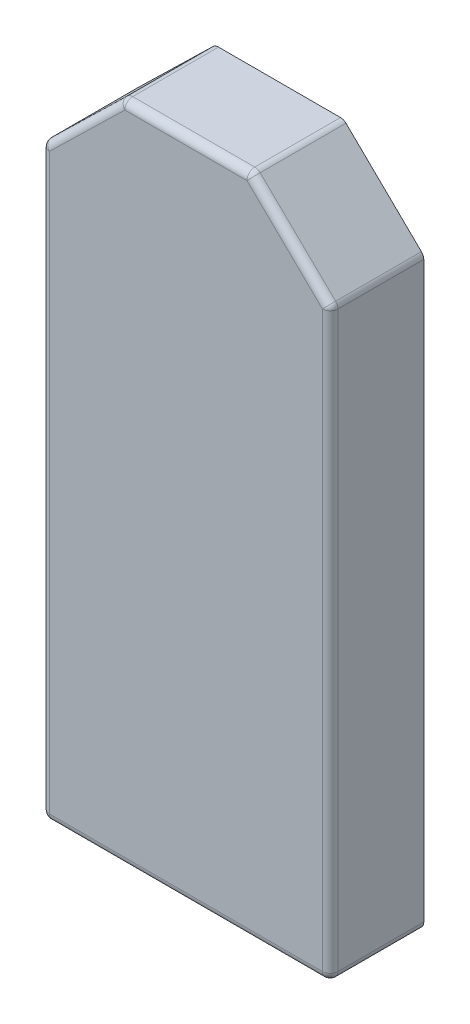
ISO-10303-21;
HEADER;
FILE_DESCRIPTION(('STEP AP214'),'2;1');
FILE_NAME('part.step','',(''),(''),'','','');
FILE_SCHEMA(('AUTOMOTIVE_DESIGN { 1 0 10303 214 1 1 1 1 }'));
ENDSEC;
DATA;
#1=APPLICATION_CONTEXT('core data for automotive mechanical design processes');
#2=APPLICATION_PROTOCOL_DEFINITION('international standard','automotive_design',2000,#1);
#3=PRODUCT_CONTEXT('',#1,'mechanical');
#4=PRODUCT('Part','Part','',(#3));
#5=PRODUCT_RELATED_PRODUCT_CATEGORY('part','',(#4));
#6=PRODUCT_DEFINITION_FORMATION('','',#4);
#7=PRODUCT_DEFINITION_CONTEXT('part definition',#1,'design');
#8=PRODUCT_DEFINITION('design','',#6,#7);
#9=PRODUCT_DEFINITION_SHAPE('','',#8);
#10=(LENGTH_UNIT() NAMED_UNIT(*) SI_UNIT(.MILLI.,.METRE.));
#11=(NAMED_UNIT(*) PLANE_ANGLE_UNIT() SI_UNIT($,.RADIAN.));
#12=(NAMED_UNIT(*) SI_UNIT($,.STERADIAN.) SOLID_ANGLE_UNIT());
#13=UNCERTAINTY_MEASURE_WITH_UNIT(LENGTH_MEASURE(1.E-05),#10,'distance_accuracy_value','');
#14=(GEOMETRIC_REPRESENTATION_CONTEXT(3) GLOBAL_UNCERTAINTY_ASSIGNED_CONTEXT((#13)) GLOBAL_UNIT_ASSIGNED_CONTEXT((#10,
#11,#12)) REPRESENTATION_CONTEXT('',''));
#15=CARTESIAN_POINT('',(0.,0.,0.));
#16=DIRECTION('',(0.,0.,1.));
#17=DIRECTION('',(1.,0.,0.));
#18=AXIS2_PLACEMENT_3D('',#15,#16,#17);
#19=CARTESIAN_POINT('',(0.,0.,1.2));
#20=DIRECTION('',(0.,0.,-1.));
#21=DIRECTION('',(-1.,0.,0.));
#22=AXIS2_PLACEMENT_3D('',#19,#20,#21);
#23=PLANE('',#22);
#24=DIRECTION('',(-0.716360665962732,-0.69773017439511,0.));
#25=VECTOR('',#24,1.);
#26=CARTESIAN_POINT('',(-3.7952734000401,3.8966131609836,1.2));
#27=LINE('',#26,#25);
#28=CARTESIAN_POINT('',(-1.74999999999968,5.88869485098902,1.2));
#29=VERTEX_POINT('',#28);
#30=CARTESIAN_POINT('',(-0.782646706856141,6.83089005235603,1.2));
#31=VERTEX_POINT('',#30);
#32=EDGE_CURVE('E311',#29,#31,#27,.F.);
#33=ORIENTED_EDGE('',*,*,#32,.F.);
#34=DIRECTION('',(0.,-1.,0.));
#35=VECTOR('',#34,1.);
#36=CARTESIAN_POINT('',(-1.75,0.,1.2));
#37=LINE('',#36,#35);
#38=CARTESIAN_POINT('',(-1.75,-1.46910994764397,1.2));
#39=VERTEX_POINT('',#38);
#40=EDGE_CURVE('E142',#39,#29,#37,.F.);
#41=ORIENTED_EDGE('',*,*,#40,.F.);
#42=DIRECTION('',(1.,0.,0.));
#43=VECTOR('',#42,1.);
#44=CARTESIAN_POINT('',(0.,-1.46910994764397,1.2));
#45=LINE('',#44,#43);
#46=CARTESIAN_POINT('',(1.75,-1.46910994764359,1.2));
#47=VERTEX_POINT('',#46);
#48=EDGE_CURVE('E246',#47,#39,#45,.F.);
#49=ORIENTED_EDGE('',*,*,#48,.F.);
#50=DIRECTION('',(0.,1.,0.));
#51=VECTOR('',#50,1.);
#52=CARTESIAN_POINT('',(1.75,0.,1.2));
#53=LINE('',#52,#51);
#54=CARTESIAN_POINT('',(1.75,5.88869485097675,1.2));
#55=VERTEX_POINT('',#54);
#56=EDGE_CURVE('E319',#55,#47,#53,.F.);
#57=ORIENTED_EDGE('',*,*,#56,.F.);
#58=DIRECTION('',(-0.716360665962733,0.69773017439511,0.));
#59=VECTOR('',#58,1.);
#60=CARTESIAN_POINT('',(3.7952734000401,3.8966131609836,1.2));
#61=LINE('',#60,#59);
#62=CARTESIAN_POINT('',(0.78264670685614,6.83089005235603,1.2));
#63=VERTEX_POINT('',#62);
#64=EDGE_CURVE('E324',#63,#55,#61,.F.);
#65=ORIENTED_EDGE('',*,*,#64,.F.);
#66=DIRECTION('',(-1.,0.,0.));
#67=VECTOR('',#66,1.);
#68=CARTESIAN_POINT('',(0.,6.83089005235603,1.2));
#69=LINE('',#68,#67);
#70=EDGE_CURVE('E328',#31,#63,#69,.F.);
#71=ORIENTED_EDGE('',*,*,#70,.F.);
#72=EDGE_LOOP('',(#33,#41,#49,#57,#65,#71));
#73=FACE_BOUND('',#72,.T.);
#74=ADVANCED_FACE('F17',(#73),#23,.F.);
#75=CARTESIAN_POINT('',(-3.7952734000401,3.8966131609836,1.1));
#76=DIRECTION('',(-0.716360665962732,-0.69773017439511,0.));
#77=DIRECTION('',(0.69773017439511,-0.716360665962732,0.));
#78=AXIS2_PLACEMENT_3D('',#75,#76,#77);
#79=CYLINDRICAL_SURFACE('',#78,0.1);
#80=CARTESIAN_POINT('',(-1.75,5.88869485097675,1.1));
#81=DIRECTION('',(-0.716360665962732,-0.69773017439511,0.));
#82=DIRECTION('',(0.69773017439511,-0.716360665962732,0.));
#83=AXIS2_PLACEMENT_3D('',#80,#81,#82);
#84=CIRCLE('',#83,0.1);
#85=CARTESIAN_POINT('',(-1.81977301743951,5.96033091757302,1.1));
#86=VERTEX_POINT('',#85);
#87=EDGE_CURVE('E147',#29,#86,#84,.T.);
#88=ORIENTED_EDGE('',*,*,#87,.F.);
#89=ORIENTED_EDGE('',*,*,#32,.T.);
#90=CARTESIAN_POINT('',(-0.782646706856139,6.83089005235603,1.1));
#91=DIRECTION('',(-0.716360665962732,-0.69773017439511,0.));
#92=DIRECTION('',(0.69773017439511,-0.716360665962732,0.));
#93=AXIS2_PLACEMENT_3D('',#90,#91,#92);
#94=CIRCLE('',#93,0.1);
#95=CARTESIAN_POINT('',(-0.852419724295651,6.9025261189523,1.1));
#96=VERTEX_POINT('',#95);
#97=EDGE_CURVE('E20',#96,#31,#94,.F.);
#98=ORIENTED_EDGE('',*,*,#97,.F.);
#99=DIRECTION('',(0.716360665962732,0.69773017439511,0.));
#100=VECTOR('',#99,1.);
#101=CARTESIAN_POINT('',(-1.85,5.93089005235603,1.1));
#102=LINE('',#101,#100);
#103=EDGE_CURVE('E216',#96,#86,#102,.F.);
#104=ORIENTED_EDGE('',*,*,#103,.T.);
#105=EDGE_LOOP('',(#88,#89,#98,#104));
#106=FACE_BOUND('',#105,.T.);
#107=ADVANCED_FACE('F305',(#106),#79,.T.);
#108=CARTESIAN_POINT('',(-0.782646706856141,6.83089005235603,1.1));
#109=DIRECTION('',(1.,0.,0.));
#110=DIRECTION('',(0.,0.,-1.));
#111=AXIS2_PLACEMENT_3D('',#108,#109,#110);
#112=SPHERICAL_SURFACE('',#111,0.1);
#113=CARTESIAN_POINT('',(-0.782646706856141,6.83089005235603,1.1));
#114=DIRECTION('',(0.,0.,-1.));
#115=DIRECTION('',(-1.,0.,0.));
#116=AXIS2_PLACEMENT_3D('',#113,#114,#115);
#117=CIRCLE('',#116,0.1);
#118=CARTESIAN_POINT('',(-0.782646706856141,6.93089005235603,1.1));
#119=VERTEX_POINT('',#118);
#120=EDGE_CURVE('E215',#96,#119,#117,.T.);
#121=ORIENTED_EDGE('',*,*,#120,.F.);
#122=ORIENTED_EDGE('',*,*,#97,.T.);
#123=CARTESIAN_POINT('',(-0.782646706856141,6.83089005235603,1.1));
#124=DIRECTION('',(-1.,0.,0.));
#125=DIRECTION('',(0.,0.,1.));
#126=AXIS2_PLACEMENT_3D('',#123,#124,#125);
#127=CIRCLE('',#126,0.1);
#128=EDGE_CURVE('E105',#119,#31,#127,.F.);
#129=ORIENTED_EDGE('',*,*,#128,.F.);
#130=EDGE_LOOP('',(#121,#122,#129));
#131=FACE_BOUND('',#130,.T.);
#132=ADVANCED_FACE('F302',(#131),#112,.T.);
#133=CARTESIAN_POINT('',(0.,6.83089005235603,1.1));
#134=DIRECTION('',(-1.,0.,0.));
#135=DIRECTION('',(0.,0.,1.));
#136=AXIS2_PLACEMENT_3D('',#133,#134,#135);
#137=CYLINDRICAL_SURFACE('',#136,0.1);
#138=ORIENTED_EDGE('',*,*,#128,.T.);
#139=ORIENTED_EDGE('',*,*,#70,.T.);
#140=CARTESIAN_POINT('',(0.782646706856141,6.83089005235603,1.1));
#141=DIRECTION('',(1.,0.,0.));
#142=DIRECTION('',(0.,0.,-1.));
#143=AXIS2_PLACEMENT_3D('',#140,#141,#142);
#144=CIRCLE('',#143,0.1);
#145=CARTESIAN_POINT('',(0.78264670685614,6.93089005235603,1.1));
#146=VERTEX_POINT('',#145);
#147=EDGE_CURVE('E110',#146,#63,#144,.T.);
#148=ORIENTED_EDGE('',*,*,#147,.F.);
#149=DIRECTION('',(1.,0.,0.));
#150=VECTOR('',#149,1.);
#151=CARTESIAN_POINT('',(-0.823298429319365,6.93089005235603,1.1));
#152=LINE('',#151,#150);
#153=EDGE_CURVE('E209',#146,#119,#152,.F.);
#154=ORIENTED_EDGE('',*,*,#153,.T.);
#155=EDGE_LOOP('',(#138,#139,#148,#154));
#156=FACE_BOUND('',#155,.T.);
#157=ADVANCED_FACE('F298',(#156),#137,.T.);
#158=CARTESIAN_POINT('',(0.782646706856141,6.83089005235603,1.1));
#159=DIRECTION('',(1.,0.,0.));
#160=DIRECTION('',(0.,0.,-1.));
#161=AXIS2_PLACEMENT_3D('',#158,#159,#160);
#162=SPHERICAL_SURFACE('',#161,0.1);
#163=CARTESIAN_POINT('',(0.782646706856141,6.83089005235603,1.1));
#164=DIRECTION('',(0.,0.,-1.));
#165=DIRECTION('',(-1.,0.,0.));
#166=AXIS2_PLACEMENT_3D('',#163,#164,#165);
#167=CIRCLE('',#166,0.1);
#168=CARTESIAN_POINT('',(0.852419724295651,6.9025261189523,1.1));
#169=VERTEX_POINT('',#168);
#170=EDGE_CURVE('E204',#146,#169,#167,.T.);
#171=ORIENTED_EDGE('',*,*,#170,.F.);
#172=ORIENTED_EDGE('',*,*,#147,.T.);
#173=CARTESIAN_POINT('',(0.782646706856141,6.83089005235603,1.1));
#174=DIRECTION('',(-0.716360665962733,0.69773017439511,0.));
#175=DIRECTION('',(-0.69773017439511,-0.716360665962733,0.));
#176=AXIS2_PLACEMENT_3D('',#173,#174,#175);
#177=CIRCLE('',#176,0.1);
#178=EDGE_CURVE('E327',#169,#63,#177,.F.);
#179=ORIENTED_EDGE('',*,*,#178,.F.);
#180=EDGE_LOOP('',(#171,#172,#179));
#181=FACE_BOUND('',#180,.T.);
#182=ADVANCED_FACE('F295',(#181),#162,.T.);
#183=CARTESIAN_POINT('',(3.7952734000401,3.89661316098361,1.1));
#184=DIRECTION('',(-0.716360665962733,0.69773017439511,0.));
#185=DIRECTION('',(-0.69773017439511,-0.716360665962733,0.));
#186=AXIS2_PLACEMENT_3D('',#183,#184,#185);
#187=CYLINDRICAL_SURFACE('',#186,0.1);
#188=ORIENTED_EDGE('',*,*,#178,.T.);
#189=ORIENTED_EDGE('',*,*,#64,.T.);
#190=CARTESIAN_POINT('',(1.75,5.88869485097675,1.1));
#191=DIRECTION('',(-0.716360665962733,0.69773017439511,0.));
#192=DIRECTION('',(-0.69773017439511,-0.716360665962733,0.));
#193=AXIS2_PLACEMENT_3D('',#190,#191,#192);
#194=CIRCLE('',#193,0.1);
#195=CARTESIAN_POINT('',(1.81977301743951,5.96033091757302,1.1));
#196=VERTEX_POINT('',#195);
#197=EDGE_CURVE('E326',#196,#55,#194,.F.);
#198=ORIENTED_EDGE('',*,*,#197,.F.);
#199=DIRECTION('',(0.716360665962733,-0.69773017439511,0.));
#200=VECTOR('',#199,1.);
#201=CARTESIAN_POINT('',(0.823298429319365,6.93089005235603,1.1));
#202=LINE('',#201,#200);
#203=EDGE_CURVE('E200',#196,#169,#202,.F.);
#204=ORIENTED_EDGE('',*,*,#203,.T.);
#205=EDGE_LOOP('',(#188,#189,#198,#204));
#206=FACE_BOUND('',#205,.T.);
#207=ADVANCED_FACE('F278',(#206),#187,.T.);
#208=CARTESIAN_POINT('',(1.75,5.88869485097675,1.1));
#209=DIRECTION('',(1.,0.,0.));
#210=DIRECTION('',(0.,0.,-1.));
#211=AXIS2_PLACEMENT_3D('',#208,#209,#210);
#212=SPHERICAL_SURFACE('',#211,0.1);
#213=CARTESIAN_POINT('',(1.75,5.88869485097675,1.1));
#214=DIRECTION('',(0.,0.,-1.));
#215=DIRECTION('',(-1.,0.,0.));
#216=AXIS2_PLACEMENT_3D('',#213,#214,#215);
#217=CIRCLE('',#216,0.1);
#218=CARTESIAN_POINT('',(1.85,5.88869485097675,1.1));
#219=VERTEX_POINT('',#218);
#220=EDGE_CURVE('E197',#196,#219,#217,.T.);
#221=ORIENTED_EDGE('',*,*,#220,.F.);
#222=ORIENTED_EDGE('',*,*,#197,.T.);
#223=CARTESIAN_POINT('',(1.75,5.88869485097675,1.1));
#224=DIRECTION('',(0.,1.,0.));
#225=DIRECTION('',(-1.,0.,0.));
#226=AXIS2_PLACEMENT_3D('',#223,#224,#225);
#227=CIRCLE('',#226,0.1);
#228=EDGE_CURVE('E321',#219,#55,#227,.F.);
#229=ORIENTED_EDGE('',*,*,#228,.F.);
#230=EDGE_LOOP('',(#221,#222,#229));
#231=FACE_BOUND('',#230,.T.);
#232=ADVANCED_FACE('F273',(#231),#212,.T.);
#233=CARTESIAN_POINT('',(1.75,0.,1.1));
#234=DIRECTION('',(0.,1.,0.));
#235=DIRECTION('',(-1.,0.,0.));
#236=AXIS2_PLACEMENT_3D('',#233,#234,#235);
#237=CYLINDRICAL_SURFACE('',#236,0.1);
#238=ORIENTED_EDGE('',*,*,#228,.T.);
#239=ORIENTED_EDGE('',*,*,#56,.T.);
#240=CARTESIAN_POINT('',(1.75,-1.46910994764397,1.1));
#241=DIRECTION('',(0.,-1.,1.53323024347533E-11));
#242=DIRECTION('',(1.,0.,0.));
#243=AXIS2_PLACEMENT_3D('',#240,#241,#242);
#244=CIRCLE('',#243,0.1);
#245=CARTESIAN_POINT('',(1.85,-1.46910994764397,1.1));
#246=VERTEX_POINT('',#245);
#247=EDGE_CURVE('E260',#246,#47,#244,.T.);
#248=ORIENTED_EDGE('',*,*,#247,.F.);
#249=DIRECTION('',(0.,-1.,0.));
#250=VECTOR('',#249,1.);
#251=CARTESIAN_POINT('',(1.85,5.93089005235603,1.1));
#252=LINE('',#251,#250);
#253=EDGE_CURVE('E191',#246,#219,#252,.F.);
#254=ORIENTED_EDGE('',*,*,#253,.T.);
#255=EDGE_LOOP('',(#238,#239,#248,#254));
#256=FACE_BOUND('',#255,.T.);
#257=ADVANCED_FACE('F269',(#256),#237,.T.);
#258=CARTESIAN_POINT('',(1.75,-1.46910994764397,1.1));
#259=DIRECTION('',(1.,0.,0.));
#260=DIRECTION('',(0.,0.,-1.));
#261=AXIS2_PLACEMENT_3D('',#258,#259,#260);
#262=SPHERICAL_SURFACE('',#261,0.1);
#263=ORIENTED_EDGE('',*,*,#247,.T.);
#264=CARTESIAN_POINT('',(1.75,-1.46910994764397,1.1));
#265=DIRECTION('',(1.,0.,0.));
#266=DIRECTION('',(0.,1.,0.));
#267=AXIS2_PLACEMENT_3D('',#264,#265,#266);
#268=CIRCLE('',#267,0.1);
#269=CARTESIAN_POINT('',(1.75,-1.56910994764397,1.1));
#270=VERTEX_POINT('',#269);
#271=EDGE_CURVE('E257',#270,#47,#268,.F.);
#272=ORIENTED_EDGE('',*,*,#271,.F.);
#273=CARTESIAN_POINT('',(1.75,-1.46910994764397,1.1));
#274=DIRECTION('',(0.,0.,-1.));
#275=DIRECTION('',(-1.,0.,0.));
#276=AXIS2_PLACEMENT_3D('',#273,#274,#275);
#277=CIRCLE('',#276,0.1);
#278=EDGE_CURVE('E186',#246,#270,#277,.T.);
#279=ORIENTED_EDGE('',*,*,#278,.F.);
#280=EDGE_LOOP('',(#263,#272,#279));
#281=FACE_BOUND('',#280,.T.);
#282=ADVANCED_FACE('F266',(#281),#262,.T.);
#283=CARTESIAN_POINT('',(0.,-1.46910994764397,1.1));
#284=DIRECTION('',(1.,0.,0.));
#285=DIRECTION('',(0.,1.,0.));
#286=AXIS2_PLACEMENT_3D('',#283,#284,#285);
#287=CYLINDRICAL_SURFACE('',#286,0.1);
#288=CARTESIAN_POINT('',(-1.75,-1.46910994764397,1.1));
#289=DIRECTION('',(1.,0.,0.));
#290=DIRECTION('',(0.,0.,-1.));
#291=AXIS2_PLACEMENT_3D('',#288,#289,#290);
#292=CIRCLE('',#291,0.1);
#293=CARTESIAN_POINT('',(-1.75,-1.56910994764397,1.1));
#294=VERTEX_POINT('',#293);
#295=EDGE_CURVE('E242',#294,#39,#292,.F.);
#296=ORIENTED_EDGE('',*,*,#295,.F.);
#297=DIRECTION('',(-1.,0.,0.));
#298=VECTOR('',#297,1.);
#299=CARTESIAN_POINT('',(1.85,-1.56910994764397,1.1));
#300=LINE('',#299,#298);
#301=EDGE_CURVE('E180',#294,#270,#300,.F.);
#302=ORIENTED_EDGE('',*,*,#301,.T.);
#303=ORIENTED_EDGE('',*,*,#271,.T.);
#304=ORIENTED_EDGE('',*,*,#48,.T.);
#305=EDGE_LOOP('',(#296,#302,#303,#304));
#306=FACE_BOUND('',#305,.T.);
#307=ADVANCED_FACE('F234',(#306),#287,.T.);
#308=CARTESIAN_POINT('',(-1.75,-1.46910994764397,1.1));
#309=DIRECTION('',(1.,0.,0.));
#310=DIRECTION('',(0.,0.,-1.));
#311=AXIS2_PLACEMENT_3D('',#308,#309,#310);
#312=SPHERICAL_SURFACE('',#311,0.1);
#313=ORIENTED_EDGE('',*,*,#295,.T.);
#314=CARTESIAN_POINT('',(-1.75,-1.46910994764397,1.1));
#315=DIRECTION('',(0.,-1.,0.));
#316=DIRECTION('',(0.,0.,-1.));
#317=AXIS2_PLACEMENT_3D('',#314,#315,#316);
#318=CIRCLE('',#317,0.1);
#319=CARTESIAN_POINT('',(-1.85,-1.46910994764397,1.1));
#320=VERTEX_POINT('',#319);
#321=EDGE_CURVE('E245',#320,#39,#318,.F.);
#322=ORIENTED_EDGE('',*,*,#321,.F.);
#323=CARTESIAN_POINT('',(-1.75,-1.46910994764397,1.1));
#324=DIRECTION('',(0.,0.,-1.));
#325=DIRECTION('',(-1.,0.,0.));
#326=AXIS2_PLACEMENT_3D('',#323,#324,#325);
#327=CIRCLE('',#326,0.1);
#328=EDGE_CURVE('E152',#294,#320,#327,.T.);
#329=ORIENTED_EDGE('',*,*,#328,.F.);
#330=EDGE_LOOP('',(#313,#322,#329));
#331=FACE_BOUND('',#330,.T.);
#332=ADVANCED_FACE('F230',(#331),#312,.T.);
#333=CARTESIAN_POINT('',(-1.75,0.,1.1));
#334=DIRECTION('',(0.,-1.,0.));
#335=DIRECTION('',(0.,0.,-1.));
#336=AXIS2_PLACEMENT_3D('',#333,#334,#335);
#337=CYLINDRICAL_SURFACE('',#336,0.1);
#338=CARTESIAN_POINT('',(-1.75,5.88869485097675,1.1));
#339=DIRECTION('',(0.,-1.,1.22659782671316E-10));
#340=DIRECTION('',(1.,0.,0.));
#341=AXIS2_PLACEMENT_3D('',#338,#339,#340);
#342=CIRCLE('',#341,0.1);
#343=CARTESIAN_POINT('',(-1.85,5.88869485097675,1.1));
#344=VERTEX_POINT('',#343);
#345=EDGE_CURVE('E136',#344,#29,#342,.F.);
#346=ORIENTED_EDGE('',*,*,#345,.F.);
#347=DIRECTION('',(0.,1.,0.));
#348=VECTOR('',#347,1.);
#349=CARTESIAN_POINT('',(-1.85,-1.56910994764397,1.1));
#350=LINE('',#349,#348);
#351=EDGE_CURVE('E139',#344,#320,#350,.F.);
#352=ORIENTED_EDGE('',*,*,#351,.T.);
#353=ORIENTED_EDGE('',*,*,#321,.T.);
#354=ORIENTED_EDGE('',*,*,#40,.T.);
#355=EDGE_LOOP('',(#346,#352,#353,#354));
#356=FACE_BOUND('',#355,.T.);
#357=ADVANCED_FACE('F137',(#356),#337,.T.);
#358=CARTESIAN_POINT('',(-1.75,5.88869485097675,1.1));
#359=DIRECTION('',(1.,0.,0.));
#360=DIRECTION('',(0.,0.,-1.));
#361=AXIS2_PLACEMENT_3D('',#358,#359,#360);
#362=SPHERICAL_SURFACE('',#361,0.1);
#363=ORIENTED_EDGE('',*,*,#345,.T.);
#364=ORIENTED_EDGE('',*,*,#87,.T.);
#365=CARTESIAN_POINT('',(-1.75,5.88869485097675,1.1));
#366=DIRECTION('',(0.,0.,-1.));
#367=DIRECTION('',(-1.,0.,0.));
#368=AXIS2_PLACEMENT_3D('',#365,#366,#367);
#369=CIRCLE('',#368,0.1);
#370=EDGE_CURVE('E155',#344,#86,#369,.T.);
#371=ORIENTED_EDGE('',*,*,#370,.F.);
#372=EDGE_LOOP('',(#363,#364,#371));
#373=FACE_BOUND('',#372,.T.);
#374=ADVANCED_FACE('F156',(#373),#362,.T.);
#375=CARTESIAN_POINT('',(-1.85,5.93089005235603,1.2));
#376=DIRECTION('',(0.69773017439511,-0.716360665962732,0.));
#377=DIRECTION('',(0.716360665962732,0.69773017439511,0.));
#378=AXIS2_PLACEMENT_3D('',#375,#376,#377);
#379=PLANE('',#378);
#380=DIRECTION('',(0.,0.,-1.));
#381=VECTOR('',#380,1.);
#382=CARTESIAN_POINT('',(-0.852419724295651,6.9025261189523,1.2));
#383=LINE('',#382,#381);
#384=CARTESIAN_POINT('',(-0.852419724295652,6.9025261189523,0.));
#385=VERTEX_POINT('',#384);
#386=EDGE_CURVE('E212',#385,#96,#383,.F.);
#387=ORIENTED_EDGE('',*,*,#386,.F.);
#388=DIRECTION('',(0.716360665962732,0.69773017439511,0.));
#389=VECTOR('',#388,1.);
#390=CARTESIAN_POINT('',(-1.81977301743951,5.96033091757302,0.));
#391=LINE('',#390,#389);
#392=CARTESIAN_POINT('',(-1.81977301743951,5.96033091757302,0.));
#393=VERTEX_POINT('',#392);
#394=EDGE_CURVE('E349',#393,#385,#391,.T.);
#395=ORIENTED_EDGE('',*,*,#394,.F.);
#396=DIRECTION('',(0.,0.,-1.));
#397=VECTOR('',#396,1.);
#398=CARTESIAN_POINT('',(-1.81977301743951,5.96033091757302,1.2));
#399=LINE('',#398,#397);
#400=EDGE_CURVE('E160',#86,#393,#399,.T.);
#401=ORIENTED_EDGE('',*,*,#400,.F.);
#402=ORIENTED_EDGE('',*,*,#103,.F.);
#403=EDGE_LOOP('',(#387,#395,#401,#402));
#404=FACE_BOUND('',#403,.T.);
#405=ADVANCED_FACE('F226',(#404),#379,.F.);
#406=CARTESIAN_POINT('',(-0.782646706856141,6.83089005235603,1.2));
#407=DIRECTION('',(0.,0.,-1.));
#408=DIRECTION('',(-1.,0.,0.));
#409=AXIS2_PLACEMENT_3D('',#406,#407,#408);
#410=CYLINDRICAL_SURFACE('',#409,0.1);
#411=ORIENTED_EDGE('',*,*,#120,.T.);
#412=DIRECTION('',(0.,0.,-1.));
#413=VECTOR('',#412,1.);
#414=CARTESIAN_POINT('',(-0.782646706856141,6.93089005235603,1.2));
#415=LINE('',#414,#413);
#416=CARTESIAN_POINT('',(-0.782646706856141,6.93089005235603,0.));
#417=VERTEX_POINT('',#416);
#418=EDGE_CURVE('E205',#119,#417,#415,.T.);
#419=ORIENTED_EDGE('',*,*,#418,.T.);
#420=CARTESIAN_POINT('',(-0.782646706856141,6.83089005235603,0.));
#421=DIRECTION('',(0.,0.,-1.));
#422=DIRECTION('',(-1.,0.,0.));
#423=AXIS2_PLACEMENT_3D('',#420,#421,#422);
#424=CIRCLE('',#423,0.1);
#425=EDGE_CURVE('E346',#385,#417,#424,.T.);
#426=ORIENTED_EDGE('',*,*,#425,.F.);
#427=ORIENTED_EDGE('',*,*,#386,.T.);
#428=EDGE_LOOP('',(#411,#419,#426,#427));
#429=FACE_BOUND('',#428,.T.);
#430=ADVANCED_FACE('F435',(#429),#410,.T.);
#431=CARTESIAN_POINT('',(-0.823298429319365,6.93089005235603,1.2));
#432=DIRECTION('',(0.,-1.,0.));
#433=DIRECTION('',(0.,0.,-1.));
#434=AXIS2_PLACEMENT_3D('',#431,#432,#433);
#435=PLANE('',#434);
#436=ORIENTED_EDGE('',*,*,#418,.F.);
#437=ORIENTED_EDGE('',*,*,#153,.F.);
#438=DIRECTION('',(0.,0.,-1.));
#439=VECTOR('',#438,1.);
#440=CARTESIAN_POINT('',(0.78264670685614,6.93089005235603,1.2));
#441=LINE('',#440,#439);
#442=CARTESIAN_POINT('',(0.78264670685614,6.93089005235603,0.));
#443=VERTEX_POINT('',#442);
#444=EDGE_CURVE('E201',#443,#146,#441,.F.);
#445=ORIENTED_EDGE('',*,*,#444,.F.);
#446=DIRECTION('',(-1.,0.,0.));
#447=VECTOR('',#446,1.);
#448=CARTESIAN_POINT('',(0.,6.93089005235603,0.));
#449=LINE('',#448,#447);
#450=EDGE_CURVE('E345',#417,#443,#449,.F.);
#451=ORIENTED_EDGE('',*,*,#450,.F.);
#452=EDGE_LOOP('',(#436,#437,#445,#451));
#453=FACE_BOUND('',#452,.T.);
#454=ADVANCED_FACE('F382',(#453),#435,.F.);
#455=CARTESIAN_POINT('',(0.782646706856141,6.83089005235603,1.2));
#456=DIRECTION('',(0.,0.,-1.));
#457=DIRECTION('',(-1.,0.,0.));
#458=AXIS2_PLACEMENT_3D('',#455,#456,#457);
#459=CYLINDRICAL_SURFACE('',#458,0.1);
#460=ORIENTED_EDGE('',*,*,#170,.T.);
#461=DIRECTION('',(0.,0.,1.));
#462=VECTOR('',#461,1.);
#463=CARTESIAN_POINT('',(0.852419724295652,6.9025261189523,1.2));
#464=LINE('',#463,#462);
#465=CARTESIAN_POINT('',(0.852419724295652,6.9025261189523,0.));
#466=VERTEX_POINT('',#465);
#467=EDGE_CURVE('E198',#169,#466,#464,.F.);
#468=ORIENTED_EDGE('',*,*,#467,.T.);
#469=CARTESIAN_POINT('',(0.782646706856141,6.83089005235603,0.));
#470=DIRECTION('',(0.,0.,-1.));
#471=DIRECTION('',(-1.,0.,0.));
#472=AXIS2_PLACEMENT_3D('',#469,#470,#471);
#473=CIRCLE('',#472,0.1);
#474=EDGE_CURVE('E342',#443,#466,#473,.T.);
#475=ORIENTED_EDGE('',*,*,#474,.F.);
#476=ORIENTED_EDGE('',*,*,#444,.T.);
#477=EDGE_LOOP('',(#460,#468,#475,#476));
#478=FACE_BOUND('',#477,.T.);
#479=ADVANCED_FACE('F376',(#478),#459,.T.);
#480=CARTESIAN_POINT('',(0.823298429319365,6.93089005235603,1.2));
#481=DIRECTION('',(-0.69773017439511,-0.716360665962733,0.));
#482=DIRECTION('',(0.716360665962733,-0.69773017439511,0.));
#483=AXIS2_PLACEMENT_3D('',#480,#481,#482);
#484=PLANE('',#483);
#485=ORIENTED_EDGE('',*,*,#467,.F.);
#486=ORIENTED_EDGE('',*,*,#203,.F.);
#487=DIRECTION('',(0.,0.,-1.));
#488=VECTOR('',#487,1.);
#489=CARTESIAN_POINT('',(1.81977301743951,5.96033091757302,1.2));
#490=LINE('',#489,#488);
#491=CARTESIAN_POINT('',(1.81977301743951,5.96033091757302,0.));
#492=VERTEX_POINT('',#491);
#493=EDGE_CURVE('E194',#492,#196,#490,.F.);
#494=ORIENTED_EDGE('',*,*,#493,.F.);
#495=DIRECTION('',(0.716360665962733,-0.697730174395109,0.));
#496=VECTOR('',#495,1.);
#497=CARTESIAN_POINT('',(0.852419724295652,6.9025261189523,0.));
#498=LINE('',#497,#496);
#499=EDGE_CURVE('E341',#466,#492,#498,.T.);
#500=ORIENTED_EDGE('',*,*,#499,.F.);
#501=EDGE_LOOP('',(#485,#486,#494,#500));
#502=FACE_BOUND('',#501,.T.);
#503=ADVANCED_FACE('F374',(#502),#484,.F.);
#504=CARTESIAN_POINT('',(1.75,5.88869485097675,1.2));
#505=DIRECTION('',(0.,0.,-1.));
#506=DIRECTION('',(-1.,0.,0.));
#507=AXIS2_PLACEMENT_3D('',#504,#505,#506);
#508=CYLINDRICAL_SURFACE('',#507,0.1);
#509=ORIENTED_EDGE('',*,*,#220,.T.);
#510=DIRECTION('',(0.,0.,1.));
#511=VECTOR('',#510,1.);
#512=CARTESIAN_POINT('',(1.85,5.88869485097675,1.2));
#513=LINE('',#512,#511);
#514=CARTESIAN_POINT('',(1.85,5.88869485097675,0.));
#515=VERTEX_POINT('',#514);
#516=EDGE_CURVE('E187',#219,#515,#513,.F.);
#517=ORIENTED_EDGE('',*,*,#516,.T.);
#518=CARTESIAN_POINT('',(1.75,5.88869485097675,0.));
#519=DIRECTION('',(0.,0.,-1.));
#520=DIRECTION('',(-1.,0.,0.));
#521=AXIS2_PLACEMENT_3D('',#518,#519,#520);
#522=CIRCLE('',#521,0.1);
#523=EDGE_CURVE('E338',#492,#515,#522,.T.);
#524=ORIENTED_EDGE('',*,*,#523,.F.);
#525=ORIENTED_EDGE('',*,*,#493,.T.);
#526=EDGE_LOOP('',(#509,#517,#524,#525));
#527=FACE_BOUND('',#526,.T.);
#528=ADVANCED_FACE('F369',(#527),#508,.T.);
#529=CARTESIAN_POINT('',(1.85,5.93089005235603,1.2));
#530=DIRECTION('',(-1.,0.,0.));
#531=DIRECTION('',(0.,-1.,0.));
#532=AXIS2_PLACEMENT_3D('',#529,#530,#531);
#533=PLANE('',#532);
#534=ORIENTED_EDGE('',*,*,#516,.F.);
#535=ORIENTED_EDGE('',*,*,#253,.F.);
#536=DIRECTION('',(0.,0.,-1.));
#537=VECTOR('',#536,1.);
#538=CARTESIAN_POINT('',(1.85,-1.46910994764397,1.2));
#539=LINE('',#538,#537);
#540=CARTESIAN_POINT('',(1.85,-1.46910994764397,0.));
#541=VERTEX_POINT('',#540);
#542=EDGE_CURVE('E183',#541,#246,#539,.F.);
#543=ORIENTED_EDGE('',*,*,#542,.F.);
#544=DIRECTION('',(0.,1.,0.));
#545=VECTOR('',#544,1.);
#546=CARTESIAN_POINT('',(1.85,0.,0.));
#547=LINE('',#546,#545);
#548=EDGE_CURVE('E337',#515,#541,#547,.F.);
#549=ORIENTED_EDGE('',*,*,#548,.F.);
#550=EDGE_LOOP('',(#534,#535,#543,#549));
#551=FACE_BOUND('',#550,.T.);
#552=ADVANCED_FACE('F416',(#551),#533,.F.);
#553=CARTESIAN_POINT('',(1.75,-1.46910994764397,1.2));
#554=DIRECTION('',(0.,0.,-1.));
#555=DIRECTION('',(-1.,0.,0.));
#556=AXIS2_PLACEMENT_3D('',#553,#554,#555);
#557=CYLINDRICAL_SURFACE('',#556,0.1);
#558=ORIENTED_EDGE('',*,*,#278,.T.);
#559=DIRECTION('',(0.,0.,1.));
#560=VECTOR('',#559,1.);
#561=CARTESIAN_POINT('',(1.75,-1.56910994764397,1.2));
#562=LINE('',#561,#560);
#563=CARTESIAN_POINT('',(1.75,-1.56910994764397,0.));
#564=VERTEX_POINT('',#563);
#565=EDGE_CURVE('E176',#270,#564,#562,.F.);
#566=ORIENTED_EDGE('',*,*,#565,.T.);
#567=CARTESIAN_POINT('',(1.75,-1.46910994764397,0.));
#568=DIRECTION('',(0.,0.,-1.));
#569=DIRECTION('',(-1.,0.,0.));
#570=AXIS2_PLACEMENT_3D('',#567,#568,#569);
#571=CIRCLE('',#570,0.1);
#572=EDGE_CURVE('E334',#541,#564,#571,.T.);
#573=ORIENTED_EDGE('',*,*,#572,.F.);
#574=ORIENTED_EDGE('',*,*,#542,.T.);
#575=EDGE_LOOP('',(#558,#566,#573,#574));
#576=FACE_BOUND('',#575,.T.);
#577=ADVANCED_FACE('F410',(#576),#557,.T.);
#578=CARTESIAN_POINT('',(1.85,-1.56910994764397,1.2));
#579=DIRECTION('',(0.,1.,0.));
#580=DIRECTION('',(-1.,0.,0.));
#581=AXIS2_PLACEMENT_3D('',#578,#579,#580);
#582=PLANE('',#581);
#583=ORIENTED_EDGE('',*,*,#565,.F.);
#584=ORIENTED_EDGE('',*,*,#301,.F.);
#585=DIRECTION('',(0.,0.,-1.));
#586=VECTOR('',#585,1.);
#587=CARTESIAN_POINT('',(-1.75,-1.56910994764397,1.2));
#588=LINE('',#587,#586);
#589=CARTESIAN_POINT('',(-1.75,-1.56910994764397,0.));
#590=VERTEX_POINT('',#589);
#591=EDGE_CURVE('E173',#590,#294,#588,.F.);
#592=ORIENTED_EDGE('',*,*,#591,.F.);
#593=DIRECTION('',(-1.,0.,0.));
#594=VECTOR('',#593,1.);
#595=CARTESIAN_POINT('',(0.,-1.56910994764397,0.));
#596=LINE('',#595,#594);
#597=EDGE_CURVE('E333',#564,#590,#596,.T.);
#598=ORIENTED_EDGE('',*,*,#597,.F.);
#599=EDGE_LOOP('',(#583,#584,#592,#598));
#600=FACE_BOUND('',#599,.T.);
#601=ADVANCED_FACE('F405',(#600),#582,.F.);
#602=CARTESIAN_POINT('',(-1.75,-1.46910994764397,1.2));
#603=DIRECTION('',(0.,0.,-1.));
#604=DIRECTION('',(-1.,0.,0.));
#605=AXIS2_PLACEMENT_3D('',#602,#603,#604);
#606=CYLINDRICAL_SURFACE('',#605,0.1);
#607=ORIENTED_EDGE('',*,*,#328,.T.);
#608=DIRECTION('',(0.,0.,-1.));
#609=VECTOR('',#608,1.);
#610=CARTESIAN_POINT('',(-1.85,-1.46910994764397,1.2));
#611=LINE('',#610,#609);
#612=CARTESIAN_POINT('',(-1.85,-1.46910994764397,0.));
#613=VERTEX_POINT('',#612);
#614=EDGE_CURVE('E151',#320,#613,#611,.T.);
#615=ORIENTED_EDGE('',*,*,#614,.T.);
#616=CARTESIAN_POINT('',(-1.75,-1.46910994764397,0.));
#617=DIRECTION('',(0.,0.,-1.));
#618=DIRECTION('',(-1.,0.,0.));
#619=AXIS2_PLACEMENT_3D('',#616,#617,#618);
#620=CIRCLE('',#619,0.1);
#621=EDGE_CURVE('E330',#590,#613,#620,.T.);
#622=ORIENTED_EDGE('',*,*,#621,.F.);
#623=ORIENTED_EDGE('',*,*,#591,.T.);
#624=EDGE_LOOP('',(#607,#615,#622,#623));
#625=FACE_BOUND('',#624,.T.);
#626=ADVANCED_FACE('F399',(#625),#606,.T.);
#627=CARTESIAN_POINT('',(-1.85,-1.56910994764397,1.2));
#628=DIRECTION('',(1.,0.,0.));
#629=DIRECTION('',(0.,0.,-1.));
#630=AXIS2_PLACEMENT_3D('',#627,#628,#629);
#631=PLANE('',#630);
#632=ORIENTED_EDGE('',*,*,#614,.F.);
#633=ORIENTED_EDGE('',*,*,#351,.F.);
#634=DIRECTION('',(0.,0.,-1.));
#635=VECTOR('',#634,1.);
#636=CARTESIAN_POINT('',(-1.85,5.88869485097675,1.2));
#637=LINE('',#636,#635);
#638=CARTESIAN_POINT('',(-1.85,5.88869485097675,0.));
#639=VERTEX_POINT('',#638);
#640=EDGE_CURVE('E35',#639,#344,#637,.F.);
#641=ORIENTED_EDGE('',*,*,#640,.F.);
#642=DIRECTION('',(0.,1.,0.));
#643=VECTOR('',#642,1.);
#644=CARTESIAN_POINT('',(-1.85,0.,0.));
#645=LINE('',#644,#643);
#646=EDGE_CURVE('E26',#613,#639,#645,.T.);
#647=ORIENTED_EDGE('',*,*,#646,.F.);
#648=EDGE_LOOP('',(#632,#633,#641,#647));
#649=FACE_BOUND('',#648,.T.);
#650=ADVANCED_FACE('F150',(#649),#631,.F.);
#651=CARTESIAN_POINT('',(-1.75,5.88869485097675,1.2));
#652=DIRECTION('',(0.,0.,-1.));
#653=DIRECTION('',(-1.,0.,0.));
#654=AXIS2_PLACEMENT_3D('',#651,#652,#653);
#655=CYLINDRICAL_SURFACE('',#654,0.1);
#656=ORIENTED_EDGE('',*,*,#370,.T.);
#657=ORIENTED_EDGE('',*,*,#400,.T.);
#658=CARTESIAN_POINT('',(-1.75,5.88869485097675,0.));
#659=DIRECTION('',(0.,0.,-1.));
#660=DIRECTION('',(-1.,0.,0.));
#661=AXIS2_PLACEMENT_3D('',#658,#659,#660);
#662=CIRCLE('',#661,0.1);
#663=EDGE_CURVE('E11',#639,#393,#662,.T.);
#664=ORIENTED_EDGE('',*,*,#663,.F.);
#665=ORIENTED_EDGE('',*,*,#640,.T.);
#666=EDGE_LOOP('',(#656,#657,#664,#665));
#667=FACE_BOUND('',#666,.T.);
#668=ADVANCED_FACE('F162',(#667),#655,.T.);
#669=CARTESIAN_POINT('',(0.,0.,0.));
#670=DIRECTION('',(0.,0.,-1.));
#671=DIRECTION('',(-1.,0.,0.));
#672=AXIS2_PLACEMENT_3D('',#669,#670,#671);
#673=PLANE('',#672);
#674=ORIENTED_EDGE('',*,*,#646,.T.);
#675=ORIENTED_EDGE('',*,*,#663,.T.);
#676=ORIENTED_EDGE('',*,*,#394,.T.);
#677=ORIENTED_EDGE('',*,*,#425,.T.);
#678=ORIENTED_EDGE('',*,*,#450,.T.);
#679=ORIENTED_EDGE('',*,*,#474,.T.);
#680=ORIENTED_EDGE('',*,*,#499,.T.);
#681=ORIENTED_EDGE('',*,*,#523,.T.);
#682=ORIENTED_EDGE('',*,*,#548,.T.);
#683=ORIENTED_EDGE('',*,*,#572,.T.);
#684=ORIENTED_EDGE('',*,*,#597,.T.);
#685=ORIENTED_EDGE('',*,*,#621,.T.);
#686=EDGE_LOOP('',(#674,#675,#676,#677,#678,#679,#680,#681,#682,#683,#684,#685));
#687=FACE_BOUND('',#686,.T.);
#688=ADVANCED_FACE('F426',(#687),#673,.T.);
#689=CLOSED_SHELL('',(#74,#107,#132,#157,#182,#207,#232,#257,#282,#307,#332,#357,#374,#405,#430,
#454,#479,#503,#528,#552,#577,#601,#626,#650,#668,#688));
#690=MANIFOLD_SOLID_BREP('B1',#689);
#691=ADVANCED_BREP_SHAPE_REPRESENTATION('',(#18,#690),#14);
#692=SHAPE_DEFINITION_REPRESENTATION(#9,#691);
ENDSEC;
END-ISO-10303-21;
